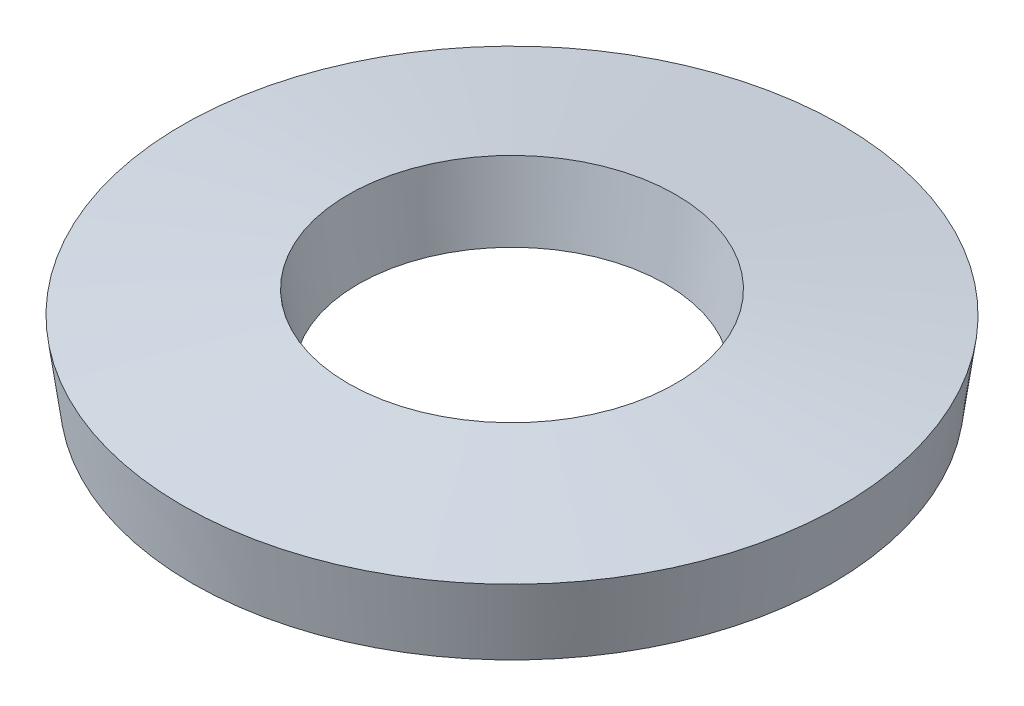
ISO-10303-21;
HEADER;
FILE_DESCRIPTION(('STEP AP214'),'2;1');
FILE_NAME('part.step','',(''),(''),'','','');
FILE_SCHEMA(('AUTOMOTIVE_DESIGN { 1 0 10303 214 1 1 1 1 }'));
ENDSEC;
DATA;
#1=APPLICATION_CONTEXT('core data for automotive mechanical design processes');
#2=APPLICATION_PROTOCOL_DEFINITION('international standard','automotive_design',2000,#1);
#3=PRODUCT_CONTEXT('',#1,'mechanical');
#4=PRODUCT('Part','Part','',(#3));
#5=PRODUCT_RELATED_PRODUCT_CATEGORY('part','',(#4));
#6=PRODUCT_DEFINITION_FORMATION('','',#4);
#7=PRODUCT_DEFINITION_CONTEXT('part definition',#1,'design');
#8=PRODUCT_DEFINITION('design','',#6,#7);
#9=PRODUCT_DEFINITION_SHAPE('','',#8);
#10=(LENGTH_UNIT() NAMED_UNIT(*) SI_UNIT(.MILLI.,.METRE.));
#11=(NAMED_UNIT(*) PLANE_ANGLE_UNIT() SI_UNIT($,.RADIAN.));
#12=(NAMED_UNIT(*) SI_UNIT($,.STERADIAN.) SOLID_ANGLE_UNIT());
#13=UNCERTAINTY_MEASURE_WITH_UNIT(LENGTH_MEASURE(1.E-05),#10,'distance_accuracy_value','');
#14=(GEOMETRIC_REPRESENTATION_CONTEXT(3) GLOBAL_UNCERTAINTY_ASSIGNED_CONTEXT((#13)) GLOBAL_UNIT_ASSIGNED_CONTEXT((#10,
#11,#12)) REPRESENTATION_CONTEXT('',''));
#15=CARTESIAN_POINT('',(0.,0.,0.));
#16=DIRECTION('',(0.,0.,1.));
#17=DIRECTION('',(1.,0.,0.));
#18=AXIS2_PLACEMENT_3D('',#15,#16,#17);
#19=CARTESIAN_POINT('',(0.,0.,0.));
#20=DIRECTION('',(0.,1.,0.));
#21=DIRECTION('',(0.,0.,1.));
#22=AXIS2_PLACEMENT_3D('',#19,#20,#21);
#23=CONICAL_SURFACE('',#22,8.72946063611701,0.135685641043846);
#24=CARTESIAN_POINT('',(0.,1.98161763531459,0.));
#25=DIRECTION('',(0.,-1.,0.));
#26=DIRECTION('',(0.,0.,-1.));
#27=AXIS2_PLACEMENT_3D('',#24,#25,#26);
#28=CIRCLE('',#27,9.);
#29=CARTESIAN_POINT('',(0.,1.98161763531459,-9.));
#30=VERTEX_POINT('',#29);
#31=EDGE_CURVE('E44',#30,#30,#28,.T.);
#32=ORIENTED_EDGE('',*,*,#31,.T.);
#33=EDGE_LOOP('',(#32));
#34=FACE_BOUND('',#33,.T.);
#35=CARTESIAN_POINT('',(0.,0.,0.));
#36=DIRECTION('',(0.,-1.,0.));
#37=DIRECTION('',(0.,0.,-1.));
#38=AXIS2_PLACEMENT_3D('',#35,#36,#37);
#39=CIRCLE('',#38,8.72946063611701);
#40=CARTESIAN_POINT('',(0.,0.,-8.72946063611701));
#41=VERTEX_POINT('',#40);
#42=EDGE_CURVE('E10',#41,#41,#39,.T.);
#43=ORIENTED_EDGE('',*,*,#42,.F.);
#44=EDGE_LOOP('',(#43));
#45=FACE_BOUND('',#44,.T.);
#46=ADVANCED_FACE('F30',(#34,#45),#23,.T.);
#47=CARTESIAN_POINT('',(0.,0.61838236468541,0.));
#48=DIRECTION('',(0.,-1.,0.));
#49=DIRECTION('',(0.,0.,-1.));
#50=AXIS2_PLACEMENT_3D('',#47,#48,#49);
#51=CONICAL_SURFACE('',#50,4.2,1.43511068575105);
#52=ORIENTED_EDGE('',*,*,#42,.T.);
#53=EDGE_LOOP('',(#52));
#54=FACE_BOUND('',#53,.T.);
#55=CARTESIAN_POINT('',(0.,0.61838236468541,0.));
#56=DIRECTION('',(0.,-1.,0.));
#57=DIRECTION('',(0.,0.,-1.));
#58=AXIS2_PLACEMENT_3D('',#55,#56,#57);
#59=CIRCLE('',#58,4.2);
#60=CARTESIAN_POINT('',(0.,0.61838236468541,-4.2));
#61=VERTEX_POINT('',#60);
#62=EDGE_CURVE('E36',#61,#61,#59,.T.);
#63=ORIENTED_EDGE('',*,*,#62,.F.);
#64=EDGE_LOOP('',(#63));
#65=FACE_BOUND('',#64,.T.);
#66=ADVANCED_FACE('F60',(#54,#65),#51,.F.);
#67=CARTESIAN_POINT('',(0.,2.6,0.));
#68=DIRECTION('',(0.,1.,0.));
#69=DIRECTION('',(0.,0.,1.));
#70=AXIS2_PLACEMENT_3D('',#67,#68,#69);
#71=CONICAL_SURFACE('',#70,4.47053936388299,0.135685641043846);
#72=ORIENTED_EDGE('',*,*,#62,.T.);
#73=EDGE_LOOP('',(#72));
#74=FACE_BOUND('',#73,.T.);
#75=CARTESIAN_POINT('',(0.,2.6,0.));
#76=DIRECTION('',(0.,-1.,0.));
#77=DIRECTION('',(0.,0.,-1.));
#78=AXIS2_PLACEMENT_3D('',#75,#76,#77);
#79=CIRCLE('',#78,4.47053936388299);
#80=CARTESIAN_POINT('',(0.,2.6,-4.47053936388299));
#81=VERTEX_POINT('',#80);
#82=EDGE_CURVE('E40',#81,#81,#79,.T.);
#83=ORIENTED_EDGE('',*,*,#82,.F.);
#84=EDGE_LOOP('',(#83));
#85=FACE_BOUND('',#84,.T.);
#86=ADVANCED_FACE('F54',(#74,#85),#71,.F.);
#87=CARTESIAN_POINT('',(0.,1.98161763531459,0.));
#88=DIRECTION('',(0.,-1.,0.));
#89=DIRECTION('',(0.,0.,-1.));
#90=AXIS2_PLACEMENT_3D('',#87,#88,#89);
#91=CONICAL_SURFACE('',#90,9.,1.43511068575105);
#92=ORIENTED_EDGE('',*,*,#82,.T.);
#93=EDGE_LOOP('',(#92));
#94=FACE_BOUND('',#93,.T.);
#95=ORIENTED_EDGE('',*,*,#31,.F.);
#96=EDGE_LOOP('',(#95));
#97=FACE_BOUND('',#96,.T.);
#98=ADVANCED_FACE('F52',(#94,#97),#91,.T.);
#99=CLOSED_SHELL('',(#46,#66,#86,#98));
#100=MANIFOLD_SOLID_BREP('B2',#99);
#101=ADVANCED_BREP_SHAPE_REPRESENTATION('',(#18,#100),#14);
#102=SHAPE_DEFINITION_REPRESENTATION(#9,#101);
ENDSEC;
END-ISO-10303-21;
